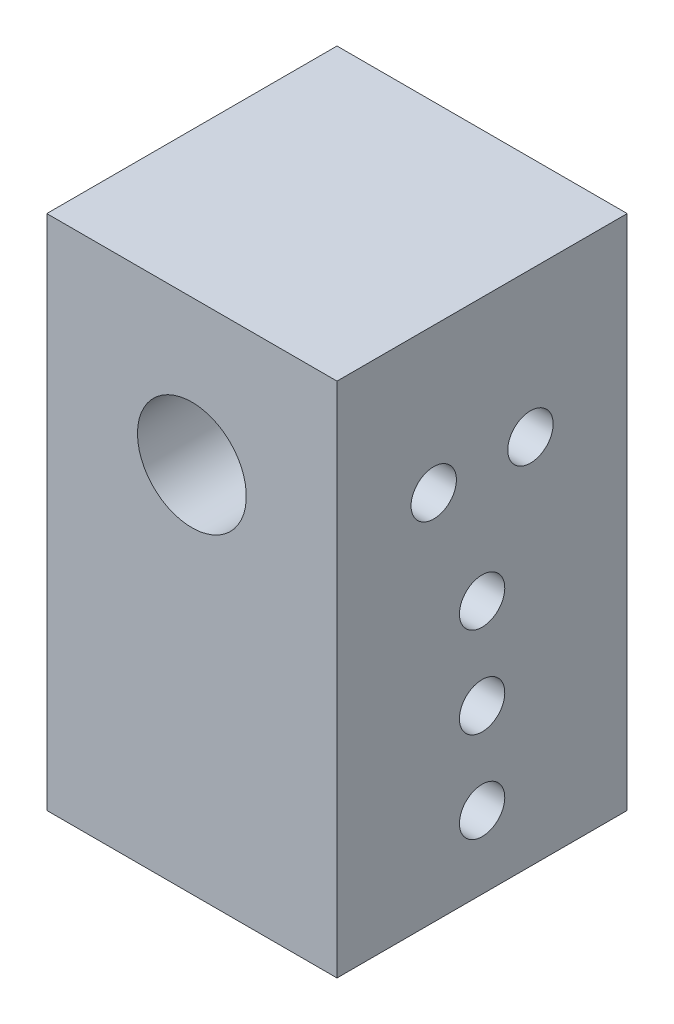
ISO-10303-21;
HEADER;
FILE_DESCRIPTION(('STEP AP214'),'2;1');
FILE_NAME('part.step','',(''),(''),'','','');
FILE_SCHEMA(('AUTOMOTIVE_DESIGN { 1 0 10303 214 1 1 1 1 }'));
ENDSEC;
DATA;
#1=APPLICATION_CONTEXT('core data for automotive mechanical design processes');
#2=APPLICATION_PROTOCOL_DEFINITION('international standard','automotive_design',2000,#1);
#3=PRODUCT_CONTEXT('',#1,'mechanical');
#4=PRODUCT('Part','Part','',(#3));
#5=PRODUCT_RELATED_PRODUCT_CATEGORY('part','',(#4));
#6=PRODUCT_DEFINITION_FORMATION('','',#4);
#7=PRODUCT_DEFINITION_CONTEXT('part definition',#1,'design');
#8=PRODUCT_DEFINITION('design','',#6,#7);
#9=PRODUCT_DEFINITION_SHAPE('','',#8);
#10=(LENGTH_UNIT() NAMED_UNIT(*) SI_UNIT(.MILLI.,.METRE.));
#11=(NAMED_UNIT(*) PLANE_ANGLE_UNIT() SI_UNIT($,.RADIAN.));
#12=(NAMED_UNIT(*) SI_UNIT($,.STERADIAN.) SOLID_ANGLE_UNIT());
#13=UNCERTAINTY_MEASURE_WITH_UNIT(LENGTH_MEASURE(1.E-05),#10,'distance_accuracy_value','');
#14=(GEOMETRIC_REPRESENTATION_CONTEXT(3) GLOBAL_UNCERTAINTY_ASSIGNED_CONTEXT((#13)) GLOBAL_UNIT_ASSIGNED_CONTEXT((#10,
#11,#12)) REPRESENTATION_CONTEXT('',''));
#15=CARTESIAN_POINT('',(0.,0.,0.));
#16=DIRECTION('',(0.,0.,1.));
#17=DIRECTION('',(1.,0.,0.));
#18=AXIS2_PLACEMENT_3D('',#15,#16,#17);
#19=CARTESIAN_POINT('',(7.99999999999999,28.5,16.));
#20=DIRECTION('',(0.,-1.,0.));
#21=DIRECTION('',(0.,0.,-1.));
#22=AXIS2_PLACEMENT_3D('',#19,#20,#21);
#23=PLANE('',#22);
#24=DIRECTION('',(-1.,0.,0.));
#25=VECTOR('',#24,1.);
#26=CARTESIAN_POINT('',(8.00000000000001,28.5,0.));
#27=LINE('',#26,#25);
#28=CARTESIAN_POINT('',(8.00000000000001,28.5,0.));
#29=VERTEX_POINT('',#28);
#30=CARTESIAN_POINT('',(-7.99999999999998,28.5,0.));
#31=VERTEX_POINT('',#30);
#32=EDGE_CURVE('E112',#29,#31,#27,.T.);
#33=ORIENTED_EDGE('',*,*,#32,.T.);
#34=DIRECTION('',(0.,0.,-1.));
#35=VECTOR('',#34,1.);
#36=CARTESIAN_POINT('',(-7.99999999999999,28.5,15.9999999999999));
#37=LINE('',#36,#35);
#38=CARTESIAN_POINT('',(-7.99999999999999,28.5,15.9999999999999));
#39=VERTEX_POINT('',#38);
#40=EDGE_CURVE('E11',#39,#31,#37,.T.);
#41=ORIENTED_EDGE('',*,*,#40,.F.);
#42=DIRECTION('',(-1.,0.,0.));
#43=VECTOR('',#42,1.);
#44=CARTESIAN_POINT('',(7.99999999999999,28.5,16.));
#45=LINE('',#44,#43);
#46=CARTESIAN_POINT('',(7.99999999999999,28.5,16.));
#47=VERTEX_POINT('',#46);
#48=EDGE_CURVE('E99',#47,#39,#45,.T.);
#49=ORIENTED_EDGE('',*,*,#48,.F.);
#50=DIRECTION('',(0.,0.,-1.));
#51=VECTOR('',#50,1.);
#52=CARTESIAN_POINT('',(7.99999999999999,28.5,16.));
#53=LINE('',#52,#51);
#54=EDGE_CURVE('E108',#47,#29,#53,.T.);
#55=ORIENTED_EDGE('',*,*,#54,.T.);
#56=EDGE_LOOP('',(#33,#41,#49,#55));
#57=FACE_BOUND('',#56,.T.);
#58=ADVANCED_FACE('F41',(#57),#23,.F.);
#59=CARTESIAN_POINT('',(-7.99999999999999,28.5,15.9999999999999));
#60=DIRECTION('',(1.,0.,0.));
#61=DIRECTION('',(0.,1.,0.));
#62=AXIS2_PLACEMENT_3D('',#59,#60,#61);
#63=PLANE('',#62);
#64=DIRECTION('',(0.,-1.,0.));
#65=VECTOR('',#64,1.);
#66=CARTESIAN_POINT('',(-7.99999999999998,28.5,0.));
#67=LINE('',#66,#65);
#68=CARTESIAN_POINT('',(-8.00000000000005,0.,0.));
#69=VERTEX_POINT('',#68);
#70=EDGE_CURVE('E103',#31,#69,#67,.T.);
#71=ORIENTED_EDGE('',*,*,#70,.T.);
#72=DIRECTION('',(0.,0.,-1.));
#73=VECTOR('',#72,1.);
#74=CARTESIAN_POINT('',(-8.00000000000002,0.,16.));
#75=LINE('',#74,#73);
#76=CARTESIAN_POINT('',(-8.00000000000002,0.,16.));
#77=VERTEX_POINT('',#76);
#78=EDGE_CURVE('E55',#77,#69,#75,.T.);
#79=ORIENTED_EDGE('',*,*,#78,.F.);
#80=DIRECTION('',(0.,-1.,0.));
#81=VECTOR('',#80,1.);
#82=CARTESIAN_POINT('',(-7.99999999999999,28.5,15.9999999999999));
#83=LINE('',#82,#81);
#84=EDGE_CURVE('E94',#39,#77,#83,.T.);
#85=ORIENTED_EDGE('',*,*,#84,.F.);
#86=ORIENTED_EDGE('',*,*,#40,.T.);
#87=EDGE_LOOP('',(#71,#79,#85,#86));
#88=FACE_BOUND('',#87,.T.);
#89=ADVANCED_FACE('F102',(#88),#63,.F.);
#90=CARTESIAN_POINT('',(-8.00000000000002,0.,16.));
#91=DIRECTION('',(0.,1.,0.));
#92=DIRECTION('',(0.,0.,1.));
#93=AXIS2_PLACEMENT_3D('',#90,#91,#92);
#94=PLANE('',#93);
#95=CARTESIAN_POINT('',(0.,0.,7.99999999999998));
#96=DIRECTION('',(0.,-1.,0.));
#97=DIRECTION('',(0.,0.,-1.));
#98=AXIS2_PLACEMENT_3D('',#95,#96,#97);
#99=CIRCLE('',#98,5.);
#100=CARTESIAN_POINT('',(0.,0.,2.99999999999998));
#101=VERTEX_POINT('',#100);
#102=EDGE_CURVE('E196',#101,#101,#99,.T.);
#103=ORIENTED_EDGE('',*,*,#102,.F.);
#104=EDGE_LOOP('',(#103));
#105=FACE_BOUND('',#104,.T.);
#106=DIRECTION('',(1.,0.,0.));
#107=VECTOR('',#106,1.);
#108=CARTESIAN_POINT('',(-8.00000000000005,0.,0.));
#109=LINE('',#108,#107);
#110=CARTESIAN_POINT('',(7.99999999999997,0.,0.));
#111=VERTEX_POINT('',#110);
#112=EDGE_CURVE('E81',#69,#111,#109,.T.);
#113=ORIENTED_EDGE('',*,*,#112,.T.);
#114=DIRECTION('',(0.,0.,-1.));
#115=VECTOR('',#114,1.);
#116=CARTESIAN_POINT('',(7.99999999999999,0.,16.));
#117=LINE('',#116,#115);
#118=CARTESIAN_POINT('',(7.99999999999999,0.,16.));
#119=VERTEX_POINT('',#118);
#120=EDGE_CURVE('E104',#119,#111,#117,.T.);
#121=ORIENTED_EDGE('',*,*,#120,.F.);
#122=DIRECTION('',(1.,0.,0.));
#123=VECTOR('',#122,1.);
#124=CARTESIAN_POINT('',(-8.00000000000002,0.,16.));
#125=LINE('',#124,#123);
#126=EDGE_CURVE('E97',#77,#119,#125,.T.);
#127=ORIENTED_EDGE('',*,*,#126,.F.);
#128=ORIENTED_EDGE('',*,*,#78,.T.);
#129=EDGE_LOOP('',(#113,#121,#127,#128));
#130=FACE_BOUND('',#129,.T.);
#131=ADVANCED_FACE('F106',(#105,#130),#94,.F.);
#132=CARTESIAN_POINT('',(7.99999999999999,0.,16.));
#133=DIRECTION('',(-1.,0.,0.));
#134=DIRECTION('',(0.,-1.,0.));
#135=AXIS2_PLACEMENT_3D('',#132,#133,#134);
#136=PLANE('',#135);
#137=CARTESIAN_POINT('',(7.99999999999998,14.,7.99999999999992));
#138=DIRECTION('',(1.,0.,0.));
#139=DIRECTION('',(0.,1.,0.));
#140=AXIS2_PLACEMENT_3D('',#137,#138,#139);
#141=CIRCLE('',#140,1.25);
#142=CARTESIAN_POINT('',(7.99999999999998,15.25,7.99999999999992));
#143=VERTEX_POINT('',#142);
#144=EDGE_CURVE('E161',#143,#143,#141,.T.);
#145=ORIENTED_EDGE('',*,*,#144,.F.);
#146=EDGE_LOOP('',(#145));
#147=FACE_BOUND('',#146,.T.);
#148=CARTESIAN_POINT('',(7.99999999999995,8.99999999999995,7.99999999999998));
#149=DIRECTION('',(1.,0.,0.));
#150=DIRECTION('',(0.,1.,0.));
#151=AXIS2_PLACEMENT_3D('',#148,#149,#150);
#152=CIRCLE('',#151,1.25);
#153=CARTESIAN_POINT('',(7.99999999999995,10.25,7.99999999999998));
#154=VERTEX_POINT('',#153);
#155=EDGE_CURVE('E215',#154,#154,#152,.T.);
#156=ORIENTED_EDGE('',*,*,#155,.F.);
#157=EDGE_LOOP('',(#156));
#158=FACE_BOUND('',#157,.T.);
#159=CARTESIAN_POINT('',(7.99999999999997,4.,8.00000000000001));
#160=DIRECTION('',(1.,0.,0.));
#161=DIRECTION('',(0.,1.,0.));
#162=AXIS2_PLACEMENT_3D('',#159,#160,#161);
#163=CIRCLE('',#162,1.25);
#164=CARTESIAN_POINT('',(7.99999999999997,5.25,8.00000000000001));
#165=VERTEX_POINT('',#164);
#166=EDGE_CURVE('E212',#165,#165,#163,.T.);
#167=ORIENTED_EDGE('',*,*,#166,.F.);
#168=EDGE_LOOP('',(#167));
#169=FACE_BOUND('',#168,.T.);
#170=CARTESIAN_POINT('',(8.00000000000001,20.5,10.6666666666666));
#171=DIRECTION('',(1.,0.,0.));
#172=DIRECTION('',(0.,1.,0.));
#173=AXIS2_PLACEMENT_3D('',#170,#171,#172);
#174=CIRCLE('',#173,1.25);
#175=CARTESIAN_POINT('',(8.00000000000001,21.75,10.6666666666666));
#176=VERTEX_POINT('',#175);
#177=EDGE_CURVE('E130',#176,#176,#174,.T.);
#178=ORIENTED_EDGE('',*,*,#177,.F.);
#179=EDGE_LOOP('',(#178));
#180=FACE_BOUND('',#179,.T.);
#181=CARTESIAN_POINT('',(7.99999999999999,20.5,5.33333333333297));
#182=DIRECTION('',(1.,0.,0.));
#183=DIRECTION('',(0.,1.,0.));
#184=AXIS2_PLACEMENT_3D('',#181,#182,#183);
#185=CIRCLE('',#184,1.25);
#186=CARTESIAN_POINT('',(7.99999999999999,21.75,5.33333333333297));
#187=VERTEX_POINT('',#186);
#188=EDGE_CURVE('E207',#187,#187,#185,.T.);
#189=ORIENTED_EDGE('',*,*,#188,.F.);
#190=EDGE_LOOP('',(#189));
#191=FACE_BOUND('',#190,.T.);
#192=DIRECTION('',(0.,1.,0.));
#193=VECTOR('',#192,1.);
#194=CARTESIAN_POINT('',(7.99999999999997,0.,0.));
#195=LINE('',#194,#193);
#196=EDGE_CURVE('E87',#111,#29,#195,.T.);
#197=ORIENTED_EDGE('',*,*,#196,.T.);
#198=ORIENTED_EDGE('',*,*,#54,.F.);
#199=DIRECTION('',(0.,1.,0.));
#200=VECTOR('',#199,1.);
#201=CARTESIAN_POINT('',(7.99999999999999,0.,16.));
#202=LINE('',#201,#200);
#203=EDGE_CURVE('E64',#119,#47,#202,.T.);
#204=ORIENTED_EDGE('',*,*,#203,.F.);
#205=ORIENTED_EDGE('',*,*,#120,.T.);
#206=EDGE_LOOP('',(#197,#198,#204,#205));
#207=FACE_BOUND('',#206,.T.);
#208=ADVANCED_FACE('F176',(#147,#158,#169,#180,#191,#207),#136,.F.);
#209=CARTESIAN_POINT('',(0.,0.,15.9999999999999));
#210=DIRECTION('',(0.,0.,1.));
#211=DIRECTION('',(1.,0.,0.));
#212=AXIS2_PLACEMENT_3D('',#209,#210,#211);
#213=PLANE('',#212);
#214=CARTESIAN_POINT('',(0.,20.5,15.9999999999999));
#215=DIRECTION('',(0.,0.,-1.));
#216=DIRECTION('',(-1.,0.,0.));
#217=AXIS2_PLACEMENT_3D('',#214,#215,#216);
#218=CIRCLE('',#217,3.);
#219=CARTESIAN_POINT('',(-3.00000000000003,20.5,15.9999999999999));
#220=VERTEX_POINT('',#219);
#221=EDGE_CURVE('E199',#220,#220,#218,.T.);
#222=ORIENTED_EDGE('',*,*,#221,.T.);
#223=EDGE_LOOP('',(#222));
#224=FACE_BOUND('',#223,.T.);
#225=ORIENTED_EDGE('',*,*,#48,.T.);
#226=ORIENTED_EDGE('',*,*,#84,.T.);
#227=ORIENTED_EDGE('',*,*,#126,.T.);
#228=ORIENTED_EDGE('',*,*,#203,.T.);
#229=EDGE_LOOP('',(#225,#226,#227,#228));
#230=FACE_BOUND('',#229,.T.);
#231=ADVANCED_FACE('F95',(#224,#230),#213,.T.);
#232=CARTESIAN_POINT('',(0.,0.,0.));
#233=DIRECTION('',(0.,0.,1.));
#234=DIRECTION('',(1.,0.,0.));
#235=AXIS2_PLACEMENT_3D('',#232,#233,#234);
#236=PLANE('',#235);
#237=CARTESIAN_POINT('',(0.,20.5,0.));
#238=DIRECTION('',(0.,0.,-1.));
#239=DIRECTION('',(-1.,0.,0.));
#240=AXIS2_PLACEMENT_3D('',#237,#238,#239);
#241=CIRCLE('',#240,3.);
#242=CARTESIAN_POINT('',(-2.99999999999999,20.5,0.));
#243=VERTEX_POINT('',#242);
#244=EDGE_CURVE('E202',#243,#243,#241,.T.);
#245=ORIENTED_EDGE('',*,*,#244,.F.);
#246=EDGE_LOOP('',(#245));
#247=FACE_BOUND('',#246,.T.);
#248=ORIENTED_EDGE('',*,*,#32,.F.);
#249=ORIENTED_EDGE('',*,*,#196,.F.);
#250=ORIENTED_EDGE('',*,*,#112,.F.);
#251=ORIENTED_EDGE('',*,*,#70,.F.);
#252=EDGE_LOOP('',(#248,#249,#250,#251));
#253=FACE_BOUND('',#252,.T.);
#254=ADVANCED_FACE('F170',(#247,#253),#236,.F.);
#255=CARTESIAN_POINT('',(0.,16.,7.9999999999999));
#256=DIRECTION('',(0.,-1.,0.));
#257=DIRECTION('',(0.,0.,-1.));
#258=AXIS2_PLACEMENT_3D('',#255,#256,#257);
#259=CYLINDRICAL_SURFACE('',#258,5.);
#260=CARTESIAN_POINT('',(4.99999999999998,15.25,7.9999999999999));
#261=CARTESIAN_POINT('',(4.99999883223342,15.2499980618849,8.06906340722468));
#262=CARTESIAN_POINT('',(4.99855481776522,15.2442570410219,8.13814846485889));
#263=CARTESIAN_POINT('',(4.99293428191576,15.2214790405775,8.27433860314205));
#264=CARTESIAN_POINT('',(4.98875621183306,15.2044356587184,8.34144253905889));
#265=CARTESIAN_POINT('',(4.97813021943365,15.1596339554482,8.4716840601521));
#266=CARTESIAN_POINT('',(4.97168502368403,15.1318885010706,8.53482630285831));
#267=CARTESIAN_POINT('',(4.95721119839659,15.066515508296,8.65556010992033));
#268=CARTESIAN_POINT('',(4.94918251545041,15.0288876365675,8.71315148695727));
#269=CARTESIAN_POINT('',(4.93222844659833,14.9439993419548,8.8223349394174));
#270=CARTESIAN_POINT('',(4.92328922623775,14.896573687534,8.87379640838421));
#271=CARTESIAN_POINT('',(4.90561350097938,14.7937898292426,8.96812410600275));
#272=CARTESIAN_POINT('',(4.89687701906955,14.7384307308779,9.01098936412427));
#273=CARTESIAN_POINT('',(4.88045646416423,14.6203373110521,9.08752211899919));
#274=CARTESIAN_POINT('',(4.87278995392167,14.5575056409913,9.12104351327113));
#275=CARTESIAN_POINT('',(4.85957912343516,14.426876323618,9.17699742379207));
#276=CARTESIAN_POINT('',(4.85403446393989,14.3590794722285,9.19943171286603));
#277=CARTESIAN_POINT('',(4.84583730597957,14.2218804181646,9.23212903067017));
#278=CARTESIAN_POINT('',(4.84312909229518,14.1525375866251,9.24262689027776));
#279=CARTESIAN_POINT('',(4.84074468781447,14.0130261924883,9.25188481255652));
#280=CARTESIAN_POINT('',(4.84106800373868,13.9428577660845,9.25064678484824));
#281=CARTESIAN_POINT('',(4.84466004580513,13.8054868268796,9.23665543719931));
#282=CARTESIAN_POINT('',(4.8478571916823,13.738253648779,9.22418195015871));
#283=CARTESIAN_POINT('',(4.85672258063733,13.6068657909072,9.18852015575257));
#284=CARTESIAN_POINT('',(4.86239099975579,13.5427113308092,9.16533108505785));
#285=CARTESIAN_POINT('',(4.87562594920154,13.4185516531233,9.10865789828095));
#286=CARTESIAN_POINT('',(4.88321106224515,13.358594856842,9.07507222269406));
#287=CARTESIAN_POINT('',(4.89941425705319,13.2450677418693,8.9986302300124));
#288=CARTESIAN_POINT('',(4.9080325194561,13.1914985432773,8.95577229067395));
#289=CARTESIAN_POINT('',(4.92563233783148,13.090663653588,8.86055285390092));
#290=CARTESIAN_POINT('',(4.93461724564974,13.0436212582822,8.80795521513813));
#291=CARTESIAN_POINT('',(4.9517163798232,12.9589822979467,8.69550993125301));
#292=CARTESIAN_POINT('',(4.95983057957845,12.921386021447,8.63566206475655));
#293=CARTESIAN_POINT('',(4.97431443411817,12.8566245114796,8.51009657390109));
#294=CARTESIAN_POINT('',(4.98067800106435,12.829495549788,8.44435949434045));
#295=CARTESIAN_POINT('',(4.99089930826182,12.7867355785754,8.30906334011899));
#296=CARTESIAN_POINT('',(4.99475752782737,12.7711023696516,8.239504999292));
#297=CARTESIAN_POINT('',(4.99946249392815,12.7521186953676,8.10044997532496));
#298=CARTESIAN_POINT('',(5.00038377923565,12.7484641449373,8.03099726665678));
#299=CARTESIAN_POINT('',(4.99932337345373,12.7527075017129,7.89247260433202));
#300=CARTESIAN_POINT('',(4.99734194368204,12.7606043689993,7.82340061696278));
#301=CARTESIAN_POINT('',(4.99074650939463,12.7874757569928,7.68865477601954));
#302=CARTESIAN_POINT('',(4.98617195154842,12.8062843862309,7.62294573419265));
#303=CARTESIAN_POINT('',(4.97490588861777,12.8542559033571,7.49561892295617));
#304=CARTESIAN_POINT('',(4.96821416974909,12.8834198369276,7.43400156747271));
#305=CARTESIAN_POINT('',(4.95327756605258,12.9518634407289,7.31539738797505));
#306=CARTESIAN_POINT('',(4.94500722805777,12.9913134269973,7.25851213180343));
#307=CARTESIAN_POINT('',(4.92787090989516,13.0789915906642,7.15206115529728));
#308=CARTESIAN_POINT('',(4.91900482709752,13.1272212830141,7.10249670085581));
#309=CARTESIAN_POINT('',(4.90140797467308,13.2325016340371,7.01084119327271));
#310=CARTESIAN_POINT('',(4.89268586822735,13.289739752502,6.9689634436483));
#311=CARTESIAN_POINT('',(4.87660731981033,13.4106105287214,6.89540770082271));
#312=CARTESIAN_POINT('',(4.8692508172252,13.4742429024665,6.86372925486829));
#313=CARTESIAN_POINT('',(4.8568174561222,13.6057547686775,6.81170714949218));
#314=CARTESIAN_POINT('',(4.85172712743255,13.6736063569533,6.79129633612159));
#315=CARTESIAN_POINT('',(4.84438953408488,13.8119246982409,6.76221195003851));
#316=CARTESIAN_POINT('',(4.84214164766614,13.8823908758604,6.7535358104344));
#317=CARTESIAN_POINT('',(4.84079084336632,14.0217675198793,6.74830117472161));
#318=CARTESIAN_POINT('',(4.84159943940221,14.0906645292706,6.75140175184987));
#319=CARTESIAN_POINT('',(4.84606590839868,14.2269199072233,6.76885226807258));
#320=CARTESIAN_POINT('',(4.84972372409877,14.294278306678,6.7832019810943));
#321=CARTESIAN_POINT('',(4.85942717235598,14.4251737158878,6.82255723379761));
#322=CARTESIAN_POINT('',(4.86545846030256,14.4887310877001,6.84749882943298));
#323=CARTESIAN_POINT('',(4.87923129770692,14.6108044855947,6.90727923866239));
#324=CARTESIAN_POINT('',(4.88697308433979,14.6693198109891,6.94211942497143));
#325=CARTESIAN_POINT('',(4.90354695219594,14.7812955241683,7.02177687613563));
#326=CARTESIAN_POINT('',(4.9124022069313,14.8345842278533,7.06683069757305));
#327=CARTESIAN_POINT('',(4.93006689371904,14.9329558706628,7.1651755240085));
#328=CARTESIAN_POINT('',(4.93887631439216,14.9780368584274,7.21846848228232));
#329=CARTESIAN_POINT('',(4.95564713039719,15.0595094238038,7.33294367774778));
#330=CARTESIAN_POINT('',(4.96359027804889,15.0957288447263,7.39425131473627));
#331=CARTESIAN_POINT('',(4.97754104145931,15.1572895524504,7.52227828374119));
#332=CARTESIAN_POINT('',(4.98355004333151,15.1826386338738,7.58899369713597));
#333=CARTESIAN_POINT('',(4.99206716304618,15.2179765252747,7.71299145563035));
#334=CARTESIAN_POINT('',(4.99502154210575,15.2299593692112,7.76968319090985));
#335=CARTESIAN_POINT('',(4.99898837693288,15.2459716196849,7.88424494038633));
#336=CARTESIAN_POINT('',(5.00000097875743,15.2500016244211,7.94211486563105));
#337=CARTESIAN_POINT('',(4.99999999999998,15.25,7.9999999999999));
#338=B_SPLINE_CURVE_WITH_KNOTS('',3,(#260,#261,#262,#263,#264,#265,#266,#267,#268,#269,#270,
#271,#272,#273,#274,#275,#276,#277,#278,#279,#280,#281,#282,#283,#284,#285,#286,#287,#288,#289,
#290,#291,#292,#293,#294,#295,#296,#297,#298,#299,#300,#301,#302,#303,#304,#305,#306,#307,#308,
#309,#310,#311,#312,#313,#314,#315,#316,#317,#318,#319,#320,#321,#322,#323,#324,#325,#326,#327,
#328,#329,#330,#331,#332,#333,#334,#335,#336,#337),.UNSPECIFIED.,.T.,.F.,(4,2,2,2,2,2,2,2,2,2,2,
2,2,2,2,2,2,2,2,2,2,2,2,2,2,2,2,2,2,2,2,2,2,2,2,2,2,2,4),(0.,0.206978093726608,
0.414073531469981,0.620920751905157,0.827774950141183,1.03845362864291,1.24915607983394,
1.46298872954848,1.67678717641149,1.88630245916202,2.09578365093925,2.30018747505858,
2.50460586221706,2.71108773228242,2.91760575696814,3.13001250807528,3.34242574631884,
3.55556857507606,3.76867061407213,3.97631924124406,4.1839491759396,4.38850228761707,
4.59307606101919,4.801279896378,5.00951969173354,5.22287091003737,5.43621265624598,
5.64826878845035,5.86027852710342,6.06619816998846,6.27211367463363,6.47680333799542,
6.68152140114088,6.89157980341595,7.10168808142017,7.31560154582993,7.52936136517795,
7.70285202451792,7.876329633692),.UNSPECIFIED.);
#339=CARTESIAN_POINT('',(4.99999999999998,15.25,7.9999999999999));
#340=VERTEX_POINT('',#339);
#341=EDGE_CURVE('E44',#340,#340,#338,.T.);
#342=ORIENTED_EDGE('',*,*,#341,.T.);
#343=EDGE_LOOP('',(#342));
#344=FACE_BOUND('',#343,.T.);
#345=CARTESIAN_POINT('',(4.99999999999998,10.25,7.99999999999995));
#346=CARTESIAN_POINT('',(4.99999883223341,10.2499980618848,8.06906340722472));
#347=CARTESIAN_POINT('',(4.99855481776522,10.2442570410218,8.13814846485892));
#348=CARTESIAN_POINT('',(4.99293428191576,10.2214790405775,8.27433860314205));
#349=CARTESIAN_POINT('',(4.98875621183306,10.2044356587184,8.34144253905888));
#350=CARTESIAN_POINT('',(4.97813021943365,10.1596339554482,8.47168406015207));
#351=CARTESIAN_POINT('',(4.97168502368405,10.1318885010706,8.53482630285826));
#352=CARTESIAN_POINT('',(4.95721119839659,10.0665155082959,8.65556010992028));
#353=CARTESIAN_POINT('',(4.94918251545038,10.0288876365675,8.71315148695722));
#354=CARTESIAN_POINT('',(4.93222844659831,9.94399934195477,8.82233493941734));
#355=CARTESIAN_POINT('',(4.92328922623775,9.89657368753395,8.87379640838413));
#356=CARTESIAN_POINT('',(4.9056135009794,9.79378982924253,8.9681241060027));
#357=CARTESIAN_POINT('',(4.89687701906955,9.73843073087792,9.01098936412428));
#358=CARTESIAN_POINT('',(4.88045646416423,9.62033731105213,9.08752211899917));
#359=CARTESIAN_POINT('',(4.87278995392169,9.55750564099129,9.12104351327103));
#360=CARTESIAN_POINT('',(4.85957912343518,9.42687632361799,9.17699742379201));
#361=CARTESIAN_POINT('',(4.85403446393989,9.35907947222852,9.19943171286609));
#362=CARTESIAN_POINT('',(4.84583730597957,9.2218804181646,9.23212903067022));
#363=CARTESIAN_POINT('',(4.8431290922952,9.15253758662515,9.24262689027769));
#364=CARTESIAN_POINT('',(4.8407446878145,9.01302619248831,9.25188481255642));
#365=CARTESIAN_POINT('',(4.84106800373869,8.94285776608445,9.25064678484823));
#366=CARTESIAN_POINT('',(4.84466004580514,8.80548682687955,9.23665543719932));
#367=CARTESIAN_POINT('',(4.84785719168232,8.73825364877904,9.22418195015866));
#368=CARTESIAN_POINT('',(4.85672258063735,8.60686579090721,9.18852015575247));
#369=CARTESIAN_POINT('',(4.86239099975579,8.54271133080913,9.16533108505776));
#370=CARTESIAN_POINT('',(4.87562594920153,8.41855165312324,9.10865789828087));
#371=CARTESIAN_POINT('',(4.88321106224515,8.35859485684203,9.07507222269399));
#372=CARTESIAN_POINT('',(4.89941425705322,8.2450677418693,8.99863023001238));
#373=CARTESIAN_POINT('',(4.90803251945616,8.19149854327728,8.95577229067399));
#374=CARTESIAN_POINT('',(4.92563233783154,8.090663653588,8.86055285390098));
#375=CARTESIAN_POINT('',(4.93461724564976,8.04362125828223,8.80795521513815));
#376=CARTESIAN_POINT('',(4.95171637982318,7.95898229794675,8.69550993125301));
#377=CARTESIAN_POINT('',(4.95983057957844,7.92138602144699,8.63566206475658));
#378=CARTESIAN_POINT('',(4.97431443411818,7.85662451147963,8.51009657390112));
#379=CARTESIAN_POINT('',(4.98067800106437,7.82949554978796,8.44435949434045));
#380=CARTESIAN_POINT('',(4.9908993082618,7.78673557857534,8.30906334011898));
#381=CARTESIAN_POINT('',(4.99475752782731,7.7711023696515,8.23950499929198));
#382=CARTESIAN_POINT('',(4.9994624939281,7.75211869536758,8.10044997532493));
#383=CARTESIAN_POINT('',(5.00038377923565,7.74846414493722,8.03099726665676));
#384=CARTESIAN_POINT('',(4.99932337345374,7.75270750171289,7.89247260433201));
#385=CARTESIAN_POINT('',(4.99734194368201,7.76060436899924,7.82340061696278));
#386=CARTESIAN_POINT('',(4.9907465093946,7.78747575699277,7.68865477601953));
#387=CARTESIAN_POINT('',(4.98617195154841,7.80628438623078,7.62294573419264));
#388=CARTESIAN_POINT('',(4.97490588861778,7.85425590335702,7.49561892295616));
#389=CARTESIAN_POINT('',(4.9682141697491,7.88341983692764,7.43400156747272));
#390=CARTESIAN_POINT('',(4.95327756605258,7.95186344072894,7.31539738797504));
#391=CARTESIAN_POINT('',(4.94500722805776,7.99131342699728,7.25851213180337));
#392=CARTESIAN_POINT('',(4.92787090989514,8.07899159066411,7.15206115529719));
#393=CARTESIAN_POINT('',(4.9190048270975,8.12722128301406,7.10249670085573));
#394=CARTESIAN_POINT('',(4.90140797467305,8.23250163403702,7.01084119327263));
#395=CARTESIAN_POINT('',(4.89268586822732,8.28973975250198,6.96896344364821));
#396=CARTESIAN_POINT('',(4.87660731981032,8.41061052872139,6.89540770082266));
#397=CARTESIAN_POINT('',(4.8692508172252,8.47424290246642,6.8637292548683));
#398=CARTESIAN_POINT('',(4.85681745612219,8.60575476867752,6.81170714949217));
#399=CARTESIAN_POINT('',(4.85172712743254,8.6736063569533,6.79129633612151));
#400=CARTESIAN_POINT('',(4.84438953408485,8.81192469824088,6.76221195003842));
#401=CARTESIAN_POINT('',(4.84214164766612,8.88239087586036,6.75353581043438));
#402=CARTESIAN_POINT('',(4.84079084336629,9.0217675198793,6.74830117472158));
#403=CARTESIAN_POINT('',(4.84159943940219,9.09066452927058,6.75140175184978));
#404=CARTESIAN_POINT('',(4.84606590839867,9.22691990722329,6.76885226807252));
#405=CARTESIAN_POINT('',(4.84972372409878,9.29427830667801,6.78320198109433));
#406=CARTESIAN_POINT('',(4.85942717235599,9.42517371588783,6.82255723379764));
#407=CARTESIAN_POINT('',(4.86545846030256,9.4887310877002,6.84749882943293));
#408=CARTESIAN_POINT('',(4.87923129770691,9.61080448559476,6.90727923866236));
#409=CARTESIAN_POINT('',(4.88697308433979,9.66931981098909,6.94211942497149));
#410=CARTESIAN_POINT('',(4.90354695219594,9.78129552416833,7.02177687613572));
#411=CARTESIAN_POINT('',(4.9124022069313,9.83458422785331,7.06683069757306));
#412=CARTESIAN_POINT('',(4.93006689371904,9.93295587066284,7.16517552400845));
#413=CARTESIAN_POINT('',(4.93887631439216,9.97803685842744,7.21846848228229));
#414=CARTESIAN_POINT('',(4.9556471303972,10.0595094238038,7.33294367774776));
#415=CARTESIAN_POINT('',(4.9635902780489,10.0957288447263,7.39425131473625));
#416=CARTESIAN_POINT('',(4.9775410414593,10.1572895524504,7.52227828374118));
#417=CARTESIAN_POINT('',(4.98355004333147,10.1826386338738,7.58899369713596));
#418=CARTESIAN_POINT('',(4.99206716304614,10.2179765252747,7.71299145563036));
#419=CARTESIAN_POINT('',(4.99502154210574,10.2299593692112,7.76968319090987));
#420=CARTESIAN_POINT('',(4.99898837693289,10.2459716196849,7.88424494038637));
#421=CARTESIAN_POINT('',(5.00000097875743,10.2500016244211,7.9421148656311));
#422=CARTESIAN_POINT('',(4.99999999999998,10.25,7.99999999999995));
#423=B_SPLINE_CURVE_WITH_KNOTS('',3,(#345,#346,#347,#348,#349,#350,#351,#352,#353,#354,#355,
#356,#357,#358,#359,#360,#361,#362,#363,#364,#365,#366,#367,#368,#369,#370,#371,#372,#373,#374,
#375,#376,#377,#378,#379,#380,#381,#382,#383,#384,#385,#386,#387,#388,#389,#390,#391,#392,#393,
#394,#395,#396,#397,#398,#399,#400,#401,#402,#403,#404,#405,#406,#407,#408,#409,#410,#411,#412,
#413,#414,#415,#416,#417,#418,#419,#420,#421,#422),.UNSPECIFIED.,.T.,.F.,(4,2,2,2,2,2,2,2,2,2,2,
2,2,2,2,2,2,2,2,2,2,2,2,2,2,2,2,2,2,2,2,2,2,2,2,2,2,2,4),(0.,0.206978093726567,
0.414073531469893,0.620920751905061,0.827774950141082,1.03845362864281,1.24915607983384,
1.46298872954837,1.67678717641137,1.8863024591619,2.09578365093914,2.30018747505848,
2.50460586221698,2.71108773228228,2.91760575696795,3.1300125080751,3.34242574631867,
3.55556857507592,3.76867061407201,3.97631924124393,4.18394917593946,4.38850228761694,
4.59307606101908,4.80127989637792,5.00951969173347,5.22287091003727,5.43621265624587,
5.64826878845027,5.86027852710336,6.06619816998842,6.27211367463362,6.47680333799542,
6.68152140114089,6.89157980341592,7.10168808142011,7.31560154582987,7.5293613651779,
7.70285202451791,7.87632963369202),.UNSPECIFIED.);
#424=CARTESIAN_POINT('',(4.99999999999998,10.25,7.99999999999995));
#425=VERTEX_POINT('',#424);
#426=EDGE_CURVE('E160',#425,#425,#423,.T.);
#427=ORIENTED_EDGE('',*,*,#426,.T.);
#428=EDGE_LOOP('',(#427));
#429=FACE_BOUND('',#428,.T.);
#430=CARTESIAN_POINT('',(4.99999999999996,5.24999999999998,7.99999999999992));
#431=CARTESIAN_POINT('',(4.9999988322334,5.24999806188484,8.06906340722471));
#432=CARTESIAN_POINT('',(4.99855481776521,5.24425704102184,8.13814846485891));
#433=CARTESIAN_POINT('',(4.99293428191577,5.2214790405775,8.27433860314207));
#434=CARTESIAN_POINT('',(4.98875621183308,5.20443565871846,8.34144253905892));
#435=CARTESIAN_POINT('',(4.97813021943366,5.15963395544824,8.47168406015213));
#436=CARTESIAN_POINT('',(4.97168502368404,5.13188850107058,8.53482630285831));
#437=CARTESIAN_POINT('',(4.95721119839658,5.06651550829596,8.65556010992034));
#438=CARTESIAN_POINT('',(4.94918251545041,5.02888763656756,8.7131514869573));
#439=CARTESIAN_POINT('',(4.93222844659834,4.94399934195483,8.82233493941743));
#440=CARTESIAN_POINT('',(4.92328922623775,4.89657368753401,8.87379640838422));
#441=CARTESIAN_POINT('',(4.90561350097938,4.79378982924253,8.96812410600271));
#442=CARTESIAN_POINT('',(4.89687701906955,4.73843073087786,9.01098936412421));
#443=CARTESIAN_POINT('',(4.88045646416423,4.62033731105207,9.08752211899913));
#444=CARTESIAN_POINT('',(4.87278995392168,4.55750564099129,9.1210435132711));
#445=CARTESIAN_POINT('',(4.85957912343517,4.426876323618,9.17699742379207));
#446=CARTESIAN_POINT('',(4.85403446393989,4.35907947222849,9.19943171286604));
#447=CARTESIAN_POINT('',(4.84583730597957,4.22188041816457,9.23212903067016));
#448=CARTESIAN_POINT('',(4.84312909229519,4.15253758662515,9.24262689027773));
#449=CARTESIAN_POINT('',(4.84074468781448,4.01302619248835,9.25188481255649));
#450=CARTESIAN_POINT('',(4.84106800373869,3.94285776608449,9.25064678484823));
#451=CARTESIAN_POINT('',(4.84466004580514,3.8054868268796,9.23665543719931));
#452=CARTESIAN_POINT('',(4.8478571916823,3.73825364877909,9.2241819501587));
#453=CARTESIAN_POINT('',(4.85672258063734,3.60686579090726,9.18852015575256));
#454=CARTESIAN_POINT('',(4.8623909997558,3.54271133080917,9.16533108505785));
#455=CARTESIAN_POINT('',(4.87562594920155,3.41855165312328,9.10865789828095));
#456=CARTESIAN_POINT('',(4.88321106224515,3.35859485684206,9.07507222269405));
#457=CARTESIAN_POINT('',(4.89941425705319,3.24506774186932,8.99863023001242));
#458=CARTESIAN_POINT('',(4.90803251945613,3.19149854327728,8.95577229067402));
#459=CARTESIAN_POINT('',(4.92563233783151,3.09066365358799,8.86055285390101));
#460=CARTESIAN_POINT('',(4.93461724564975,3.04362125828222,8.80795521513818));
#461=CARTESIAN_POINT('',(4.95171637982319,2.95898229794675,8.69550993125303));
#462=CARTESIAN_POINT('',(4.95983057957844,2.92138602144701,8.63566206475658));
#463=CARTESIAN_POINT('',(4.97431443411817,2.85662451147966,8.51009657390113));
#464=CARTESIAN_POINT('',(4.98067800106435,2.82949554978798,8.44435949434048));
#465=CARTESIAN_POINT('',(4.99089930826181,2.78673557857537,8.30906334011904));
#466=CARTESIAN_POINT('',(4.99475752782735,2.77110236965155,8.23950499929205));
#467=CARTESIAN_POINT('',(4.99946249392814,2.75211869536763,8.100449975325));
#468=CARTESIAN_POINT('',(5.00038377923565,2.74846414493726,8.03099726665682));
#469=CARTESIAN_POINT('',(4.99932337345374,2.75270750171289,7.89247260433204));
#470=CARTESIAN_POINT('',(4.99734194368204,2.76060436899923,7.82340061696279));
#471=CARTESIAN_POINT('',(4.99074650939463,2.78747575699277,7.68865477601954));
#472=CARTESIAN_POINT('',(4.98617195154843,2.80628438623082,7.62294573419266));
#473=CARTESIAN_POINT('',(4.97490588861777,2.85425590335705,7.49561892295618));
#474=CARTESIAN_POINT('',(4.96821416974907,2.88341983692761,7.43400156747272));
#475=CARTESIAN_POINT('',(4.95327756605255,2.95186344072891,7.31539738797504));
#476=CARTESIAN_POINT('',(4.94500722805776,2.9913134269973,7.25851213180342));
#477=CARTESIAN_POINT('',(4.92787090989516,3.07899159066415,7.15206115529725));
#478=CARTESIAN_POINT('',(4.91900482709753,3.12722128301406,7.10249670085576));
#479=CARTESIAN_POINT('',(4.90140797467308,3.23250163403701,7.01084119327266));
#480=CARTESIAN_POINT('',(4.89268586822734,3.289739752502,6.96896344364827));
#481=CARTESIAN_POINT('',(4.87660731981032,3.41061052872141,6.89540770082272));
#482=CARTESIAN_POINT('',(4.8692508172252,3.47424290246642,6.86372925486833));
#483=CARTESIAN_POINT('',(4.85681745612219,3.60575476867752,6.81170714949219));
#484=CARTESIAN_POINT('',(4.85172712743254,3.67360635695331,6.79129633612156));
#485=CARTESIAN_POINT('',(4.84438953408487,3.81192469824091,6.76221195003847));
#486=CARTESIAN_POINT('',(4.84214164766615,3.8823908758604,6.7535358104344));
#487=CARTESIAN_POINT('',(4.84079084336631,4.02176751987933,6.74830117472162));
#488=CARTESIAN_POINT('',(4.8415994394022,4.0906645292706,6.75140175184986));
#489=CARTESIAN_POINT('',(4.84606590839869,4.2269199072233,6.76885226807255));
#490=CARTESIAN_POINT('',(4.84972372409881,4.29427830667802,6.78320198109427));
#491=CARTESIAN_POINT('',(4.85942717235602,4.42517371588782,6.82255723379758));
#492=CARTESIAN_POINT('',(4.86545846030258,4.48873108770014,6.84749882943295));
#493=CARTESIAN_POINT('',(4.8792312977069,4.61080448559472,6.90727923866238));
#494=CARTESIAN_POINT('',(4.88697308433976,4.66931981098908,6.94211942497143));
#495=CARTESIAN_POINT('',(4.90354695219592,4.78129552416835,7.02177687613563));
#496=CARTESIAN_POINT('',(4.9124022069313,4.83458422785329,7.06683069757305));
#497=CARTESIAN_POINT('',(4.93006689371904,4.93295587066283,7.1651755240085));
#498=CARTESIAN_POINT('',(4.93887631439216,4.97803685842747,7.21846848228231));
#499=CARTESIAN_POINT('',(4.95564713039719,5.05950942380384,7.33294367774777));
#500=CARTESIAN_POINT('',(4.9635902780489,5.09572884472632,7.39425131473626));
#501=CARTESIAN_POINT('',(4.9775410414593,5.15728955245041,7.52227828374119));
#502=CARTESIAN_POINT('',(4.98355004333148,5.18263863387372,7.58899369713597));
#503=CARTESIAN_POINT('',(4.99206716304616,5.21797652527466,7.71299145563036));
#504=CARTESIAN_POINT('',(4.99502154210575,5.22995936921119,7.76968319090986));
#505=CARTESIAN_POINT('',(4.99898837693289,5.24597161968496,7.88424494038635));
#506=CARTESIAN_POINT('',(5.00000097875742,5.25000162442107,7.94211486563107));
#507=CARTESIAN_POINT('',(4.99999999999996,5.24999999999998,7.99999999999992));
#508=B_SPLINE_CURVE_WITH_KNOTS('',3,(#430,#431,#432,#433,#434,#435,#436,#437,#438,#439,#440,
#441,#442,#443,#444,#445,#446,#447,#448,#449,#450,#451,#452,#453,#454,#455,#456,#457,#458,#459,
#460,#461,#462,#463,#464,#465,#466,#467,#468,#469,#470,#471,#472,#473,#474,#475,#476,#477,#478,
#479,#480,#481,#482,#483,#484,#485,#486,#487,#488,#489,#490,#491,#492,#493,#494,#495,#496,#497,
#498,#499,#500,#501,#502,#503,#504,#505,#506,#507),.UNSPECIFIED.,.T.,.F.,(4,2,2,2,2,2,2,2,2,2,2,
2,2,2,2,2,2,2,2,2,2,2,2,2,2,2,2,2,2,2,2,2,2,2,2,2,2,2,4),(0.,0.2069780937266,0.414073531469972,
0.62092075190515,0.827774950141167,1.03845362864289,1.24915607983392,1.46298872954846,
1.67678717641145,1.88630245916195,2.09578365093915,2.30018747505849,2.50460586221698,
2.71108773228232,2.91760575696802,3.13001250807517,3.34242574631875,3.55556857507596,
3.76867061407202,3.97631924124398,4.18394917593954,4.38850228761702,4.59307606101915,
4.80127989637798,5.00951969173352,5.22287091003732,5.43621265624591,5.64826878845034,
5.86027852710345,6.06619816998848,6.27211367463364,6.47680333799542,6.68152140114087,
6.89157980341596,7.1016880814202,7.31560154582993,7.52936136517793,7.70285202451793,
7.87632963369202),.UNSPECIFIED.);
#509=CARTESIAN_POINT('',(4.99999999999996,5.24999999999998,7.99999999999992));
#510=VERTEX_POINT('',#509);
#511=EDGE_CURVE('E155',#510,#510,#508,.T.);
#512=ORIENTED_EDGE('',*,*,#511,.T.);
#513=EDGE_LOOP('',(#512));
#514=FACE_BOUND('',#513,.T.);
#515=CARTESIAN_POINT('',(0.,16.,7.9999999999999));
#516=DIRECTION('',(0.,-1.,0.));
#517=DIRECTION('',(0.,0.,-1.));
#518=AXIS2_PLACEMENT_3D('',#515,#516,#517);
#519=CIRCLE('',#518,5.);
#520=CARTESIAN_POINT('',(0.,16.,2.9999999999999));
#521=VERTEX_POINT('',#520);
#522=EDGE_CURVE('E115',#521,#521,#519,.T.);
#523=ORIENTED_EDGE('',*,*,#522,.F.);
#524=EDGE_LOOP('',(#523));
#525=FACE_BOUND('',#524,.T.);
#526=ORIENTED_EDGE('',*,*,#102,.T.);
#527=EDGE_LOOP('',(#526));
#528=FACE_BOUND('',#527,.T.);
#529=ADVANCED_FACE('F165',(#344,#429,#514,#525,#528),#259,.F.);
#530=CARTESIAN_POINT('',(0.,16.,7.9999999999999));
#531=DIRECTION('',(0.,-1.,0.));
#532=DIRECTION('',(0.,0.,-1.));
#533=AXIS2_PLACEMENT_3D('',#530,#531,#532);
#534=PLANE('',#533);
#535=ORIENTED_EDGE('',*,*,#522,.T.);
#536=EDGE_LOOP('',(#535));
#537=FACE_BOUND('',#536,.T.);
#538=ADVANCED_FACE('F169',(#537),#534,.T.);
#539=CARTESIAN_POINT('',(0.,20.5,15.9999999999999));
#540=DIRECTION('',(0.,0.,-1.));
#541=DIRECTION('',(-1.,0.,0.));
#542=AXIS2_PLACEMENT_3D('',#539,#540,#541);
#543=CYLINDRICAL_SURFACE('',#542,3.);
#544=CARTESIAN_POINT('',(2.72717802865889,21.75,10.6666666666666));
#545=CARTESIAN_POINT('',(2.72718519563213,21.7499925906657,10.7333385575634));
#546=CARTESIAN_POINT('',(2.72965859534395,21.744632038815,10.8001193234928));
#547=CARTESIAN_POINT('',(2.73923833650881,21.7233967894778,10.9317536087238));
#548=CARTESIAN_POINT('',(2.74635725824264,21.7074935400328,10.9966013933419));
#549=CARTESIAN_POINT('',(2.76426917574765,21.6658998841945,11.1222277963577));
#550=CARTESIAN_POINT('',(2.77504717562612,21.6402493743143,11.1830218303817));
#551=CARTESIAN_POINT('',(2.79904148565789,21.5800063775446,11.2994261162447));
#552=CARTESIAN_POINT('',(2.8122572188078,21.5454160059153,11.3550375900997));
#553=CARTESIAN_POINT('',(2.84055762619853,21.4659738826761,11.4629923916401));
#554=CARTESIAN_POINT('',(2.85570568079141,21.4206532381844,11.5149742254107));
#555=CARTESIAN_POINT('',(2.88564295372223,21.3220216757456,11.6108668891642));
#556=CARTESIAN_POINT('',(2.90043203180787,21.268707691374,11.6547746072796));
#557=CARTESIAN_POINT('',(2.92875537930612,21.1527633937973,11.7351161975459));
#558=CARTESIAN_POINT('',(2.94220739975287,21.0898292936837,11.771143294699));
#559=CARTESIAN_POINT('',(2.96556519993422,20.9581320223624,11.8319426871723));
#560=CARTESIAN_POINT('',(2.97547255347155,20.8893714548721,11.8567199786308));
#561=CARTESIAN_POINT('',(2.99017521042365,20.7517684980252,11.8930061254234));
#562=CARTESIAN_POINT('',(2.99520971127464,20.6831165761961,11.9051383615687));
#563=CARTESIAN_POINT('',(3.00046828611201,20.544579180365,11.9178043078265));
#564=CARTESIAN_POINT('',(3.00069431131011,20.4746942182355,11.9183427225495));
#565=CARTESIAN_POINT('',(2.99645129133053,20.3402072198874,11.9081323857333));
#566=CARTESIAN_POINT('',(2.99226714648661,20.2755425113927,11.8980685661409));
#567=CARTESIAN_POINT('',(2.98006516750306,20.1489171060685,11.8681135640285));
#568=CARTESIAN_POINT('',(2.97204705074575,20.0869566089451,11.8482216570365));
#569=CARTESIAN_POINT('',(2.95279852414026,19.9663618819224,11.798938625772));
#570=CARTESIAN_POINT('',(2.94152097126082,19.9077928229251,11.7694072037958));
#571=CARTESIAN_POINT('',(2.91685713989803,19.796288232718,11.7018209099663));
#572=CARTESIAN_POINT('',(2.90347011666253,19.743354702243,11.6637630258216));
#573=CARTESIAN_POINT('',(2.87481698777058,19.640659088292,11.577084246262));
#574=CARTESIAN_POINT('',(2.85948494356006,19.5913835626837,11.5279078753876));
#575=CARTESIAN_POINT('',(2.82937860681469,19.5015685850723,11.4219552259601));
#576=CARTESIAN_POINT('',(2.81460453131372,19.4610325041757,11.3651760283745));
#577=CARTESIAN_POINT('',(2.7868161235534,19.3885981074994,11.2432716300047));
#578=CARTESIAN_POINT('',(2.77387558556713,19.3570274664446,11.1779334609234));
#579=CARTESIAN_POINT('',(2.75209844221009,19.3055356794161,11.0421856216922));
#580=CARTESIAN_POINT('',(2.74325890334594,19.2856062037269,10.9717796183971));
#581=CARTESIAN_POINT('',(2.73141212519724,19.2591997483188,10.8327698577526));
#582=CARTESIAN_POINT('',(2.72806369197116,19.2519338536713,10.7643455444076));
#583=CARTESIAN_POINT('',(2.7266028681064,19.24874369481,10.6271881842551));
#584=CARTESIAN_POINT('',(2.72848866599317,19.2528155068185,10.5584552524749));
#585=CARTESIAN_POINT('',(2.73693131345748,19.2714652243444,10.4272682812361));
#586=CARTESIAN_POINT('',(2.74318138016616,19.2853538118195,10.3646939798798));
#587=CARTESIAN_POINT('',(2.75925630297447,19.3223294143577,10.2428153701687));
#588=CARTESIAN_POINT('',(2.76908199460162,19.3454185794687,10.1835118298359));
#589=CARTESIAN_POINT('',(2.79170797857002,19.4012247919481,10.0670513563102));
#590=CARTESIAN_POINT('',(2.80461662202282,19.434308166938,10.0100916920563));
#591=CARTESIAN_POINT('',(2.83180003740792,19.508799215614,9.9022586141676));
#592=CARTESIAN_POINT('',(2.84607539920581,19.550210492124,9.85138784996474));
#593=CARTESIAN_POINT('',(2.87578619784531,19.6441555442845,9.75286653178261));
#594=CARTESIAN_POINT('',(2.8912214670884,19.6973203385203,9.70581526671599));
#595=CARTESIAN_POINT('',(2.92043361183921,19.8111484874465,9.62119437468731));
#596=CARTESIAN_POINT('',(2.93421036577011,19.8718123911963,9.5836254426029));
#597=CARTESIAN_POINT('',(2.95864251585648,19.9993453191966,9.51907679122303));
#598=CARTESIAN_POINT('',(2.96928983138824,20.0662298303615,9.49212442537718));
#599=CARTESIAN_POINT('',(2.98618173103363,20.2041411648456,9.45004987433222));
#600=CARTESIAN_POINT('',(2.99242893519916,20.2751654957748,9.43492064844052));
#601=CARTESIAN_POINT('',(2.99951534797506,20.4139834664936,9.41780854114629));
#602=CARTESIAN_POINT('',(3.00070204534222,20.4816559152061,9.41498066696969));
#603=CARTESIAN_POINT('',(2.9984952348095,20.6164868117143,9.4202798079606));
#604=CARTESIAN_POINT('',(2.9951025298431,20.6836453475411,9.42840490267947));
#605=CARTESIAN_POINT('',(2.98430065981731,20.8130864824492,9.45477273882526));
#606=CARTESIAN_POINT('',(2.97703824209231,20.8754575378435,9.4726463471362));
#607=CARTESIAN_POINT('',(2.95929499847056,20.9962922305013,9.51760091387577));
#608=CARTESIAN_POINT('',(2.94881356124204,21.0547551229858,9.54468362133149));
#609=CARTESIAN_POINT('',(2.9250582539866,21.1690245654787,9.60865619588103));
#610=CARTESIAN_POINT('',(2.91167959188763,21.2245916579766,9.6459339680906));
#611=CARTESIAN_POINT('',(2.88371561874229,21.3289186756387,9.72867384953851));
#612=CARTESIAN_POINT('',(2.86912986083797,21.377676061786,9.77413899707334));
#613=CARTESIAN_POINT('',(2.8391484525914,21.4704497872316,9.87561149252098));
#614=CARTESIAN_POINT('',(2.82376522857893,21.5139177536484,9.93212568128771));
#615=CARTESIAN_POINT('',(2.79495552690185,21.5908333230667,10.0521254073468));
#616=CARTESIAN_POINT('',(2.78153014522561,21.6242753245675,10.1156148147247));
#617=CARTESIAN_POINT('',(2.75842557732645,21.6798276604358,10.2476105016893));
#618=CARTESIAN_POINT('',(2.74872654469862,21.7019982363285,10.3160878254598));
#619=CARTESIAN_POINT('',(2.73440803066664,21.734235564538,10.4562062405172));
#620=CARTESIAN_POINT('',(2.72977151604981,21.7443429152121,10.5278358739409));
#621=CARTESIAN_POINT('',(2.72744979732686,21.7494046492365,10.6220251909285));
#622=CARTESIAN_POINT('',(2.72717562860872,21.7500024812112,10.6443398240546));
#623=CARTESIAN_POINT('',(2.72717802865889,21.75,10.6666666666666));
#624=B_SPLINE_CURVE_WITH_KNOTS('',3,(#544,#545,#546,#547,#548,#549,#550,#551,#552,#553,#554,
#555,#556,#557,#558,#559,#560,#561,#562,#563,#564,#565,#566,#567,#568,#569,#570,#571,#572,#573,
#574,#575,#576,#577,#578,#579,#580,#581,#582,#583,#584,#585,#586,#587,#588,#589,#590,#591,#592,
#593,#594,#595,#596,#597,#598,#599,#600,#601,#602,#603,#604,#605,#606,#607,#608,#609,#610,#611,
#612,#613,#614,#615,#616,#617,#618,#619,#620,#621,#622,#623),.UNSPECIFIED.,.T.,.F.,(4,2,2,2,2,2,
2,2,2,2,2,2,2,2,2,2,2,2,2,2,2,2,2,2,2,2,2,2,2,2,2,2,2,2,2,2,2,2,2,4),(0.,0.199951711985552,
0.400447161842256,0.600130652152169,0.799766938550137,1.01066841430657,1.22165100459914,
1.44178476577929,1.66182066774897,1.87040605977958,2.07890680917937,2.274718402451,
2.4705444320189,2.66935814640073,2.86824221022494,3.08114531844492,3.29413040441371,
3.51411545666725,3.73394290745571,3.93950778306314,4.14500152518458,4.337339010662,
4.52972146913536,4.73025126818175,4.9308680079547,5.14781662735518,5.36478114041872,
5.582301059556,5.79969134643013,6.00188635094058,6.20404590801918,6.3990341503649,
6.59405944632174,6.79789862829037,7.00181361048904,7.21960426908077,7.43751638139189,
7.65425125796865,7.87025464546163,7.93721375436706),.UNSPECIFIED.);
#625=CARTESIAN_POINT('',(2.72717802865889,21.75,10.6666666666666));
#626=VERTEX_POINT('',#625);
#627=EDGE_CURVE('E129',#626,#626,#624,.T.);
#628=ORIENTED_EDGE('',*,*,#627,.T.);
#629=EDGE_LOOP('',(#628));
#630=FACE_BOUND('',#629,.T.);
#631=CARTESIAN_POINT('',(2.72717802865891,21.75,5.33333333333291));
#632=CARTESIAN_POINT('',(2.72718519563215,21.7499925906657,5.40000522422977));
#633=CARTESIAN_POINT('',(2.72965859534395,21.744632038815,5.46678599015913));
#634=CARTESIAN_POINT('',(2.73923833650881,21.7233967894778,5.59842027539005));
#635=CARTESIAN_POINT('',(2.74635725824267,21.7074935400328,5.66326806000815));
#636=CARTESIAN_POINT('',(2.76426917574768,21.6658998841945,5.78889446302399));
#637=CARTESIAN_POINT('',(2.77504717562612,21.6402493743143,5.84968849704793));
#638=CARTESIAN_POINT('',(2.79904148565789,21.5800063775446,5.96609278291096));
#639=CARTESIAN_POINT('',(2.81225721880782,21.5454160059153,6.02170425676602));
#640=CARTESIAN_POINT('',(2.84055762619856,21.4659738826761,6.12965905830637));
#641=CARTESIAN_POINT('',(2.85570568079143,21.4206532381844,6.181640892077));
#642=CARTESIAN_POINT('',(2.88564295372224,21.3220216757455,6.27753355583051));
#643=CARTESIAN_POINT('',(2.9004320318079,21.268707691374,6.321441273946));
#644=CARTESIAN_POINT('',(2.92875537930614,21.1527633937973,6.40178286421225));
#645=CARTESIAN_POINT('',(2.94220739975288,21.0898292936836,6.43780996136527));
#646=CARTESIAN_POINT('',(2.96556519993423,20.9581320223623,6.49860935383853));
#647=CARTESIAN_POINT('',(2.97547255347158,20.8893714548721,6.5233866452972));
#648=CARTESIAN_POINT('',(2.99017521042368,20.7517684980252,6.55967279208972));
#649=CARTESIAN_POINT('',(2.99520971127465,20.6831165761961,6.57180502823498));
#650=CARTESIAN_POINT('',(3.00046828611201,20.544579180365,6.58447097449275));
#651=CARTESIAN_POINT('',(3.00069431131012,20.4746942182355,6.58500938921587));
#652=CARTESIAN_POINT('',(2.99645129133054,20.3402072198874,6.5747990523996));
#653=CARTESIAN_POINT('',(2.99226714648661,20.2755425113927,6.56473523280719));
#654=CARTESIAN_POINT('',(2.98006516750307,20.1489171060685,6.53478023069474));
#655=CARTESIAN_POINT('',(2.97204705074576,20.0869566089451,6.51488832370273));
#656=CARTESIAN_POINT('',(2.95279852414028,19.9663618819225,6.46560529243825));
#657=CARTESIAN_POINT('',(2.94152097126083,19.9077928229251,6.43607387046208));
#658=CARTESIAN_POINT('',(2.91685713989802,19.796288232718,6.36848757663256));
#659=CARTESIAN_POINT('',(2.90347011666251,19.743354702243,6.33042969248792));
#660=CARTESIAN_POINT('',(2.87481698777057,19.6406590882921,6.24375091292828));
#661=CARTESIAN_POINT('',(2.85948494356007,19.5913835626838,6.19457454205389));
#662=CARTESIAN_POINT('',(2.82937860681469,19.5015685850723,6.08862189262634));
#663=CARTESIAN_POINT('',(2.81460453131368,19.4610325041756,6.03184269504086));
#664=CARTESIAN_POINT('',(2.78681612355336,19.3885981074993,5.90993829667105));
#665=CARTESIAN_POINT('',(2.77387558556712,19.3570274664446,5.84460012758965));
#666=CARTESIAN_POINT('',(2.7520984422101,19.3055356794161,5.70885228835841));
#667=CARTESIAN_POINT('',(2.74325890334594,19.2856062037268,5.63844628506337));
#668=CARTESIAN_POINT('',(2.73141212519723,19.2591997483187,5.49943652441891));
#669=CARTESIAN_POINT('',(2.72806369197115,19.2519338536713,5.43101221107386));
#670=CARTESIAN_POINT('',(2.72660286810641,19.24874369481,5.29385485092142));
#671=CARTESIAN_POINT('',(2.72848866599319,19.2528155068185,5.22512191914121));
#672=CARTESIAN_POINT('',(2.73693131345749,19.2714652243444,5.09393494790249));
#673=CARTESIAN_POINT('',(2.74318138016615,19.2853538118195,5.03136064654614));
#674=CARTESIAN_POINT('',(2.75925630297445,19.3223294143577,4.90948203683509));
#675=CARTESIAN_POINT('',(2.76908199460162,19.3454185794688,4.85017849650227));
#676=CARTESIAN_POINT('',(2.79170797857002,19.4012247919481,4.73371802297651));
#677=CARTESIAN_POINT('',(2.80461662202281,19.434308166938,4.67675835872263));
#678=CARTESIAN_POINT('',(2.8318000374079,19.508799215614,4.56892528083391));
#679=CARTESIAN_POINT('',(2.84607539920578,19.550210492124,4.51805451663106));
#680=CARTESIAN_POINT('',(2.87578619784528,19.6441555442845,4.41953319844892));
#681=CARTESIAN_POINT('',(2.89122146708838,19.6973203385202,4.37248193338227));
#682=CARTESIAN_POINT('',(2.92043361183922,19.8111484874464,4.28786104135361));
#683=CARTESIAN_POINT('',(2.93421036577014,19.8718123911963,4.25029210926925));
#684=CARTESIAN_POINT('',(2.9586425158565,19.9993453191966,4.18574345788936));
#685=CARTESIAN_POINT('',(2.96928983138825,20.0662298303614,4.15879109204344));
#686=CARTESIAN_POINT('',(2.98618173103362,20.2041411648455,4.1167165409985));
#687=CARTESIAN_POINT('',(2.99242893519915,20.2751654957748,4.10158731510689));
#688=CARTESIAN_POINT('',(2.99951534797506,20.4139834664936,4.08447520781264));
#689=CARTESIAN_POINT('',(3.00070204534222,20.4816559152061,4.08164733363595));
#690=CARTESIAN_POINT('',(2.99849523480951,20.6164868117142,4.08694647462684));
#691=CARTESIAN_POINT('',(2.99510252984311,20.6836453475411,4.09507156934578));
#692=CARTESIAN_POINT('',(2.98430065981732,20.8130864824491,4.12143940549157));
#693=CARTESIAN_POINT('',(2.9770382420923,20.8754575378435,4.13931301380245));
#694=CARTESIAN_POINT('',(2.95929499847056,20.9962922305013,4.18426758054204));
#695=CARTESIAN_POINT('',(2.94881356124206,21.0547551229858,4.21135028799785));
#696=CARTESIAN_POINT('',(2.92505825398661,21.1690245654788,4.27532286254741));
#697=CARTESIAN_POINT('',(2.91167959188762,21.2245916579767,4.31260063475691));
#698=CARTESIAN_POINT('',(2.88371561874227,21.3289186756388,4.39534051620482));
#699=CARTESIAN_POINT('',(2.86912986083796,21.377676061786,4.44080566373971));
#700=CARTESIAN_POINT('',(2.83914845259139,21.4704497872316,4.54227815918738));
#701=CARTESIAN_POINT('',(2.82376522857892,21.5139177536485,4.59879234795407));
#702=CARTESIAN_POINT('',(2.79495552690181,21.5908333230668,4.71879207401313));
#703=CARTESIAN_POINT('',(2.78153014522557,21.6242753245675,4.78228148139109));
#704=CARTESIAN_POINT('',(2.75842557732641,21.6798276604357,4.9142771683557));
#705=CARTESIAN_POINT('',(2.74872654469861,21.7019982363285,4.98275449212615));
#706=CARTESIAN_POINT('',(2.73440803066664,21.734235564538,5.1228729071836));
#707=CARTESIAN_POINT('',(2.7297715160498,21.7443429152121,5.19450254060724));
#708=CARTESIAN_POINT('',(2.72744979732686,21.7494046492365,5.28869185759482));
#709=CARTESIAN_POINT('',(2.72717562860873,21.7500024812112,5.31100649072096));
#710=CARTESIAN_POINT('',(2.72717802865891,21.75,5.33333333333291));
#711=B_SPLINE_CURVE_WITH_KNOTS('',3,(#631,#632,#633,#634,#635,#636,#637,#638,#639,#640,#641,
#642,#643,#644,#645,#646,#647,#648,#649,#650,#651,#652,#653,#654,#655,#656,#657,#658,#659,#660,
#661,#662,#663,#664,#665,#666,#667,#668,#669,#670,#671,#672,#673,#674,#675,#676,#677,#678,#679,
#680,#681,#682,#683,#684,#685,#686,#687,#688,#689,#690,#691,#692,#693,#694,#695,#696,#697,#698,
#699,#700,#701,#702,#703,#704,#705,#706,#707,#708,#709,#710),.UNSPECIFIED.,.T.,.F.,(4,2,2,2,2,2,
2,2,2,2,2,2,2,2,2,2,2,2,2,2,2,2,2,2,2,2,2,2,2,2,2,2,2,2,2,2,2,2,2,4),(0.,0.199951711985515,
0.400447161842176,0.600130652152113,0.799766938550104,1.01066841430657,1.22165100459915,
1.44178476577928,1.66182066774895,1.87040605977955,2.07890680917933,2.27471840245096,
2.47054443201887,2.66935814640069,2.86824221022488,3.08114531844487,3.29413040441367,
3.51411545666724,3.73394290745573,3.93950778306311,4.14500152518451,4.33733901066191,
4.52972146913527,4.73025126818168,4.93086800795466,5.14781662735513,5.36478114041865,
5.58230105955594,5.79969134643007,6.00188635094053,6.20404590801913,6.39903415036487,
6.59405944632174,6.79789862829041,7.00181361048911,7.21960426908082,7.43751638139193,
7.65425125796869,7.87025464546166,7.93721375436707),.UNSPECIFIED.);
#712=CARTESIAN_POINT('',(2.72717802865891,21.75,5.33333333333291));
#713=VERTEX_POINT('',#712);
#714=EDGE_CURVE('E121',#713,#713,#711,.T.);
#715=ORIENTED_EDGE('',*,*,#714,.T.);
#716=EDGE_LOOP('',(#715));
#717=FACE_BOUND('',#716,.T.);
#718=ORIENTED_EDGE('',*,*,#221,.F.);
#719=EDGE_LOOP('',(#718));
#720=FACE_BOUND('',#719,.T.);
#721=ORIENTED_EDGE('',*,*,#244,.T.);
#722=EDGE_LOOP('',(#721));
#723=FACE_BOUND('',#722,.T.);
#724=ADVANCED_FACE('F136',(#630,#717,#720,#723),#543,.F.);
#725=CARTESIAN_POINT('',(-1.99999999999999,20.5,5.33333333333291));
#726=DIRECTION('',(1.,0.,0.));
#727=DIRECTION('',(0.,1.,0.));
#728=AXIS2_PLACEMENT_3D('',#725,#726,#727);
#729=CYLINDRICAL_SURFACE('',#728,1.25);
#730=ORIENTED_EDGE('',*,*,#188,.T.);
#731=EDGE_LOOP('',(#730));
#732=FACE_BOUND('',#731,.T.);
#733=ORIENTED_EDGE('',*,*,#714,.F.);
#734=EDGE_LOOP('',(#733));
#735=FACE_BOUND('',#734,.T.);
#736=ADVANCED_FACE('F139',(#732,#735),#729,.F.);
#737=CARTESIAN_POINT('',(-1.99999999999999,20.5,10.6666666666667));
#738=DIRECTION('',(1.,0.,0.));
#739=DIRECTION('',(0.,1.,0.));
#740=AXIS2_PLACEMENT_3D('',#737,#738,#739);
#741=CYLINDRICAL_SURFACE('',#740,1.25);
#742=ORIENTED_EDGE('',*,*,#177,.T.);
#743=EDGE_LOOP('',(#742));
#744=FACE_BOUND('',#743,.T.);
#745=ORIENTED_EDGE('',*,*,#627,.F.);
#746=EDGE_LOOP('',(#745));
#747=FACE_BOUND('',#746,.T.);
#748=ADVANCED_FACE('F142',(#744,#747),#741,.F.);
#749=CARTESIAN_POINT('',(0.,4.,7.99999999999995));
#750=DIRECTION('',(1.,0.,0.));
#751=DIRECTION('',(0.,1.,0.));
#752=AXIS2_PLACEMENT_3D('',#749,#750,#751);
#753=CYLINDRICAL_SURFACE('',#752,1.25);
#754=ORIENTED_EDGE('',*,*,#166,.T.);
#755=EDGE_LOOP('',(#754));
#756=FACE_BOUND('',#755,.T.);
#757=ORIENTED_EDGE('',*,*,#511,.F.);
#758=EDGE_LOOP('',(#757));
#759=FACE_BOUND('',#758,.T.);
#760=ADVANCED_FACE('F147',(#756,#759),#753,.F.);
#761=CARTESIAN_POINT('',(0.,8.99999999999998,7.9999999999999));
#762=DIRECTION('',(1.,0.,0.));
#763=DIRECTION('',(0.,1.,0.));
#764=AXIS2_PLACEMENT_3D('',#761,#762,#763);
#765=CYLINDRICAL_SURFACE('',#764,1.25);
#766=ORIENTED_EDGE('',*,*,#155,.T.);
#767=EDGE_LOOP('',(#766));
#768=FACE_BOUND('',#767,.T.);
#769=ORIENTED_EDGE('',*,*,#426,.F.);
#770=EDGE_LOOP('',(#769));
#771=FACE_BOUND('',#770,.T.);
#772=ADVANCED_FACE('F152',(#768,#771),#765,.F.);
#773=CARTESIAN_POINT('',(0.,14.,7.99999999999998));
#774=DIRECTION('',(1.,0.,0.));
#775=DIRECTION('',(0.,1.,0.));
#776=AXIS2_PLACEMENT_3D('',#773,#774,#775);
#777=CYLINDRICAL_SURFACE('',#776,1.25);
#778=ORIENTED_EDGE('',*,*,#144,.T.);
#779=EDGE_LOOP('',(#778));
#780=FACE_BOUND('',#779,.T.);
#781=ORIENTED_EDGE('',*,*,#341,.F.);
#782=EDGE_LOOP('',(#781));
#783=FACE_BOUND('',#782,.T.);
#784=ADVANCED_FACE('F221',(#780,#783),#777,.F.);
#785=CLOSED_SHELL('',(#58,#89,#131,#208,#231,#254,#529,#538,#724,#736,#748,#760,#772,#784));
#786=MANIFOLD_SOLID_BREP('B2',#785);
#787=ADVANCED_BREP_SHAPE_REPRESENTATION('',(#18,#786),#14);
#788=SHAPE_DEFINITION_REPRESENTATION(#9,#787);
ENDSEC;
END-ISO-10303-21;
